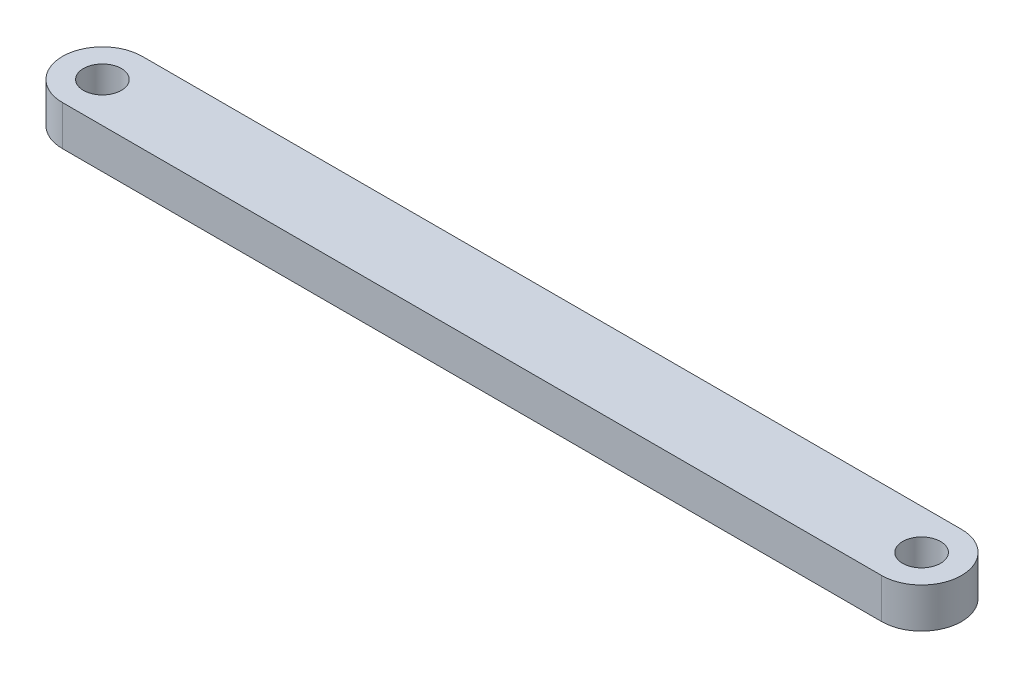
ISO-10303-21;
HEADER;
FILE_DESCRIPTION(('STEP AP214'),'2;1');
FILE_NAME('part.step','',(''),(''),'','','');
FILE_SCHEMA(('AUTOMOTIVE_DESIGN { 1 0 10303 214 1 1 1 1 }'));
ENDSEC;
DATA;
#1=APPLICATION_CONTEXT('core data for automotive mechanical design processes');
#2=APPLICATION_PROTOCOL_DEFINITION('international standard','automotive_design',2000,#1);
#3=PRODUCT_CONTEXT('',#1,'mechanical');
#4=PRODUCT('Part','Part','',(#3));
#5=PRODUCT_RELATED_PRODUCT_CATEGORY('part','',(#4));
#6=PRODUCT_DEFINITION_FORMATION('','',#4);
#7=PRODUCT_DEFINITION_CONTEXT('part definition',#1,'design');
#8=PRODUCT_DEFINITION('design','',#6,#7);
#9=PRODUCT_DEFINITION_SHAPE('','',#8);
#10=(LENGTH_UNIT() NAMED_UNIT(*) SI_UNIT(.MILLI.,.METRE.));
#11=(NAMED_UNIT(*) PLANE_ANGLE_UNIT() SI_UNIT($,.RADIAN.));
#12=(NAMED_UNIT(*) SI_UNIT($,.STERADIAN.) SOLID_ANGLE_UNIT());
#13=UNCERTAINTY_MEASURE_WITH_UNIT(LENGTH_MEASURE(1.E-05),#10,'distance_accuracy_value','');
#14=(GEOMETRIC_REPRESENTATION_CONTEXT(3) GLOBAL_UNCERTAINTY_ASSIGNED_CONTEXT((#13)) GLOBAL_UNIT_ASSIGNED_CONTEXT((#10,
#11,#12)) REPRESENTATION_CONTEXT('',''));
#15=CARTESIAN_POINT('',(0.,0.,0.));
#16=DIRECTION('',(0.,0.,1.));
#17=DIRECTION('',(1.,0.,0.));
#18=AXIS2_PLACEMENT_3D('',#15,#16,#17);
#19=CARTESIAN_POINT('',(20.5,1.,0.));
#20=DIRECTION('',(0.,1.,0.));
#21=DIRECTION('',(0.,0.,1.));
#22=AXIS2_PLACEMENT_3D('',#19,#20,#21);
#23=PLANE('',#22);
#24=CARTESIAN_POINT('',(-20.5,1.,0.));
#25=DIRECTION('',(0.,1.,0.));
#26=DIRECTION('',(0.,0.,1.));
#27=AXIS2_PLACEMENT_3D('',#24,#25,#26);
#28=CIRCLE('',#27,0.950000000000001);
#29=CARTESIAN_POINT('',(-20.5,1.,0.950000000000001));
#30=VERTEX_POINT('',#29);
#31=EDGE_CURVE('E108',#30,#30,#28,.T.);
#32=ORIENTED_EDGE('',*,*,#31,.F.);
#33=EDGE_LOOP('',(#32));
#34=FACE_BOUND('',#33,.T.);
#35=CARTESIAN_POINT('',(20.5,1.,0.));
#36=DIRECTION('',(0.,1.,0.));
#37=DIRECTION('',(0.,0.,1.));
#38=AXIS2_PLACEMENT_3D('',#35,#36,#37);
#39=CIRCLE('',#38,2.);
#40=CARTESIAN_POINT('',(20.5,1.,1.99999999999999));
#41=VERTEX_POINT('',#40);
#42=CARTESIAN_POINT('',(20.5,1.,-2.00000000000001));
#43=VERTEX_POINT('',#42);
#44=EDGE_CURVE('E93',#41,#43,#39,.T.);
#45=ORIENTED_EDGE('',*,*,#44,.T.);
#46=DIRECTION('',(-1.,0.,0.));
#47=VECTOR('',#46,1.);
#48=CARTESIAN_POINT('',(20.5,1.,-2.00000000000001));
#49=LINE('',#48,#47);
#50=CARTESIAN_POINT('',(-20.5,1.,-2.));
#51=VERTEX_POINT('',#50);
#52=EDGE_CURVE('E88',#43,#51,#49,.T.);
#53=ORIENTED_EDGE('',*,*,#52,.T.);
#54=CARTESIAN_POINT('',(-20.5,1.,0.));
#55=DIRECTION('',(0.,1.,0.));
#56=DIRECTION('',(0.,0.,1.));
#57=AXIS2_PLACEMENT_3D('',#54,#55,#56);
#58=CIRCLE('',#57,2.);
#59=CARTESIAN_POINT('',(-20.5,1.,2.00000000000001));
#60=VERTEX_POINT('',#59);
#61=EDGE_CURVE('E91',#51,#60,#58,.T.);
#62=ORIENTED_EDGE('',*,*,#61,.T.);
#63=DIRECTION('',(1.,0.,0.));
#64=VECTOR('',#63,1.);
#65=CARTESIAN_POINT('',(20.5,1.,1.99999999999999));
#66=LINE('',#65,#64);
#67=EDGE_CURVE('E58',#60,#41,#66,.T.);
#68=ORIENTED_EDGE('',*,*,#67,.T.);
#69=EDGE_LOOP('',(#45,#53,#62,#68));
#70=FACE_BOUND('',#69,.T.);
#71=CARTESIAN_POINT('',(20.5,1.,0.));
#72=DIRECTION('',(0.,1.,0.));
#73=DIRECTION('',(0.,0.,1.));
#74=AXIS2_PLACEMENT_3D('',#71,#72,#73);
#75=CIRCLE('',#74,0.950000000000001);
#76=CARTESIAN_POINT('',(20.5,1.,0.950000000000001));
#77=VERTEX_POINT('',#76);
#78=EDGE_CURVE('E123',#77,#77,#75,.T.);
#79=ORIENTED_EDGE('',*,*,#78,.F.);
#80=EDGE_LOOP('',(#79));
#81=FACE_BOUND('',#80,.T.);
#82=ADVANCED_FACE('F41',(#34,#70,#81),#23,.T.);
#83=CARTESIAN_POINT('',(20.5,-1.,0.));
#84=DIRECTION('',(0.,1.,0.));
#85=DIRECTION('',(0.,0.,1.));
#86=AXIS2_PLACEMENT_3D('',#83,#84,#85);
#87=PLANE('',#86);
#88=CARTESIAN_POINT('',(20.5,-1.,0.));
#89=DIRECTION('',(0.,1.,0.));
#90=DIRECTION('',(0.,0.,1.));
#91=AXIS2_PLACEMENT_3D('',#88,#89,#90);
#92=CIRCLE('',#91,2.);
#93=CARTESIAN_POINT('',(20.5,-1.,1.99999999999999));
#94=VERTEX_POINT('',#93);
#95=CARTESIAN_POINT('',(20.5,-1.,-2.00000000000001));
#96=VERTEX_POINT('',#95);
#97=EDGE_CURVE('E105',#94,#96,#92,.T.);
#98=ORIENTED_EDGE('',*,*,#97,.F.);
#99=DIRECTION('',(1.,0.,0.));
#100=VECTOR('',#99,1.);
#101=CARTESIAN_POINT('',(20.5,-1.,1.99999999999999));
#102=LINE('',#101,#100);
#103=CARTESIAN_POINT('',(-20.5,-1.,2.00000000000001));
#104=VERTEX_POINT('',#103);
#105=EDGE_CURVE('E81',#104,#94,#102,.T.);
#106=ORIENTED_EDGE('',*,*,#105,.F.);
#107=CARTESIAN_POINT('',(-20.5,-1.,0.));
#108=DIRECTION('',(0.,1.,0.));
#109=DIRECTION('',(0.,0.,1.));
#110=AXIS2_PLACEMENT_3D('',#107,#108,#109);
#111=CIRCLE('',#110,2.);
#112=CARTESIAN_POINT('',(-20.5,-1.,-2.));
#113=VERTEX_POINT('',#112);
#114=EDGE_CURVE('E75',#113,#104,#111,.T.);
#115=ORIENTED_EDGE('',*,*,#114,.F.);
#116=DIRECTION('',(-1.,0.,0.));
#117=VECTOR('',#116,1.);
#118=CARTESIAN_POINT('',(20.5,-1.,-2.00000000000001));
#119=LINE('',#118,#117);
#120=EDGE_CURVE('E97',#96,#113,#119,.T.);
#121=ORIENTED_EDGE('',*,*,#120,.F.);
#122=EDGE_LOOP('',(#98,#106,#115,#121));
#123=FACE_BOUND('',#122,.T.);
#124=CARTESIAN_POINT('',(-20.5,-1.,0.));
#125=DIRECTION('',(0.,1.,0.));
#126=DIRECTION('',(0.,0.,1.));
#127=AXIS2_PLACEMENT_3D('',#124,#125,#126);
#128=CIRCLE('',#127,0.950000000000001);
#129=CARTESIAN_POINT('',(-20.5,-1.,0.950000000000001));
#130=VERTEX_POINT('',#129);
#131=EDGE_CURVE('E120',#130,#130,#128,.T.);
#132=ORIENTED_EDGE('',*,*,#131,.T.);
#133=EDGE_LOOP('',(#132));
#134=FACE_BOUND('',#133,.T.);
#135=CARTESIAN_POINT('',(20.5,-1.,0.));
#136=DIRECTION('',(0.,1.,0.));
#137=DIRECTION('',(0.,0.,1.));
#138=AXIS2_PLACEMENT_3D('',#135,#136,#137);
#139=CIRCLE('',#138,0.950000000000001);
#140=CARTESIAN_POINT('',(20.5,-1.,0.950000000000001));
#141=VERTEX_POINT('',#140);
#142=EDGE_CURVE('E126',#141,#141,#139,.T.);
#143=ORIENTED_EDGE('',*,*,#142,.T.);
#144=EDGE_LOOP('',(#143));
#145=FACE_BOUND('',#144,.T.);
#146=ADVANCED_FACE('F116',(#123,#134,#145),#87,.F.);
#147=CARTESIAN_POINT('',(20.5,1.,0.));
#148=DIRECTION('',(0.,-1.,0.));
#149=DIRECTION('',(0.,0.,-1.));
#150=AXIS2_PLACEMENT_3D('',#147,#148,#149);
#151=CYLINDRICAL_SURFACE('',#150,2.);
#152=ORIENTED_EDGE('',*,*,#97,.T.);
#153=DIRECTION('',(0.,-1.,0.));
#154=VECTOR('',#153,1.);
#155=CARTESIAN_POINT('',(20.5,1.,-2.00000000000001));
#156=LINE('',#155,#154);
#157=EDGE_CURVE('E11',#43,#96,#156,.T.);
#158=ORIENTED_EDGE('',*,*,#157,.F.);
#159=ORIENTED_EDGE('',*,*,#44,.F.);
#160=DIRECTION('',(0.,-1.,0.));
#161=VECTOR('',#160,1.);
#162=CARTESIAN_POINT('',(20.5,1.,1.99999999999999));
#163=LINE('',#162,#161);
#164=EDGE_CURVE('E101',#41,#94,#163,.T.);
#165=ORIENTED_EDGE('',*,*,#164,.T.);
#166=EDGE_LOOP('',(#152,#158,#159,#165));
#167=FACE_BOUND('',#166,.T.);
#168=ADVANCED_FACE('F43',(#167),#151,.T.);
#169=CARTESIAN_POINT('',(20.5,1.,-2.00000000000001));
#170=DIRECTION('',(0.,0.,1.));
#171=DIRECTION('',(1.,0.,0.));
#172=AXIS2_PLACEMENT_3D('',#169,#170,#171);
#173=PLANE('',#172);
#174=ORIENTED_EDGE('',*,*,#120,.T.);
#175=DIRECTION('',(0.,-1.,0.));
#176=VECTOR('',#175,1.);
#177=CARTESIAN_POINT('',(-20.5,1.,-2.));
#178=LINE('',#177,#176);
#179=EDGE_CURVE('E50',#51,#113,#178,.T.);
#180=ORIENTED_EDGE('',*,*,#179,.F.);
#181=ORIENTED_EDGE('',*,*,#52,.F.);
#182=ORIENTED_EDGE('',*,*,#157,.T.);
#183=EDGE_LOOP('',(#174,#180,#181,#182));
#184=FACE_BOUND('',#183,.T.);
#185=ADVANCED_FACE('F96',(#184),#173,.F.);
#186=CARTESIAN_POINT('',(-20.5,1.,0.));
#187=DIRECTION('',(0.,-1.,0.));
#188=DIRECTION('',(0.,0.,-1.));
#189=AXIS2_PLACEMENT_3D('',#186,#187,#188);
#190=CYLINDRICAL_SURFACE('',#189,2.);
#191=ORIENTED_EDGE('',*,*,#114,.T.);
#192=DIRECTION('',(0.,-1.,0.));
#193=VECTOR('',#192,1.);
#194=CARTESIAN_POINT('',(-20.5,1.,2.00000000000001));
#195=LINE('',#194,#193);
#196=EDGE_CURVE('E98',#60,#104,#195,.T.);
#197=ORIENTED_EDGE('',*,*,#196,.F.);
#198=ORIENTED_EDGE('',*,*,#61,.F.);
#199=ORIENTED_EDGE('',*,*,#179,.T.);
#200=EDGE_LOOP('',(#191,#197,#198,#199));
#201=FACE_BOUND('',#200,.T.);
#202=ADVANCED_FACE('F99',(#201),#190,.T.);
#203=CARTESIAN_POINT('',(20.5,1.,1.99999999999999));
#204=DIRECTION('',(0.,0.,-1.));
#205=DIRECTION('',(-1.,0.,0.));
#206=AXIS2_PLACEMENT_3D('',#203,#204,#205);
#207=PLANE('',#206);
#208=ORIENTED_EDGE('',*,*,#105,.T.);
#209=ORIENTED_EDGE('',*,*,#164,.F.);
#210=ORIENTED_EDGE('',*,*,#67,.F.);
#211=ORIENTED_EDGE('',*,*,#196,.T.);
#212=EDGE_LOOP('',(#208,#209,#210,#211));
#213=FACE_BOUND('',#212,.T.);
#214=ADVANCED_FACE('F113',(#213),#207,.F.);
#215=CARTESIAN_POINT('',(-20.5,1.,0.));
#216=DIRECTION('',(0.,-1.,0.));
#217=DIRECTION('',(0.,0.,-1.));
#218=AXIS2_PLACEMENT_3D('',#215,#216,#217);
#219=CYLINDRICAL_SURFACE('',#218,0.950000000000001);
#220=ORIENTED_EDGE('',*,*,#31,.T.);
#221=EDGE_LOOP('',(#220));
#222=FACE_BOUND('',#221,.T.);
#223=ORIENTED_EDGE('',*,*,#131,.F.);
#224=EDGE_LOOP('',(#223));
#225=FACE_BOUND('',#224,.T.);
#226=ADVANCED_FACE('F143',(#222,#225),#219,.F.);
#227=CARTESIAN_POINT('',(20.5,1.,0.));
#228=DIRECTION('',(0.,-1.,0.));
#229=DIRECTION('',(0.,0.,-1.));
#230=AXIS2_PLACEMENT_3D('',#227,#228,#229);
#231=CYLINDRICAL_SURFACE('',#230,0.950000000000001);
#232=ORIENTED_EDGE('',*,*,#78,.T.);
#233=EDGE_LOOP('',(#232));
#234=FACE_BOUND('',#233,.T.);
#235=ORIENTED_EDGE('',*,*,#142,.F.);
#236=EDGE_LOOP('',(#235));
#237=FACE_BOUND('',#236,.T.);
#238=ADVANCED_FACE('F132',(#234,#237),#231,.F.);
#239=CLOSED_SHELL('',(#82,#146,#168,#185,#202,#214,#226,#238));
#240=MANIFOLD_SOLID_BREP('B2',#239);
#241=ADVANCED_BREP_SHAPE_REPRESENTATION('',(#18,#240),#14);
#242=SHAPE_DEFINITION_REPRESENTATION(#9,#241);
ENDSEC;
END-ISO-10303-21;
